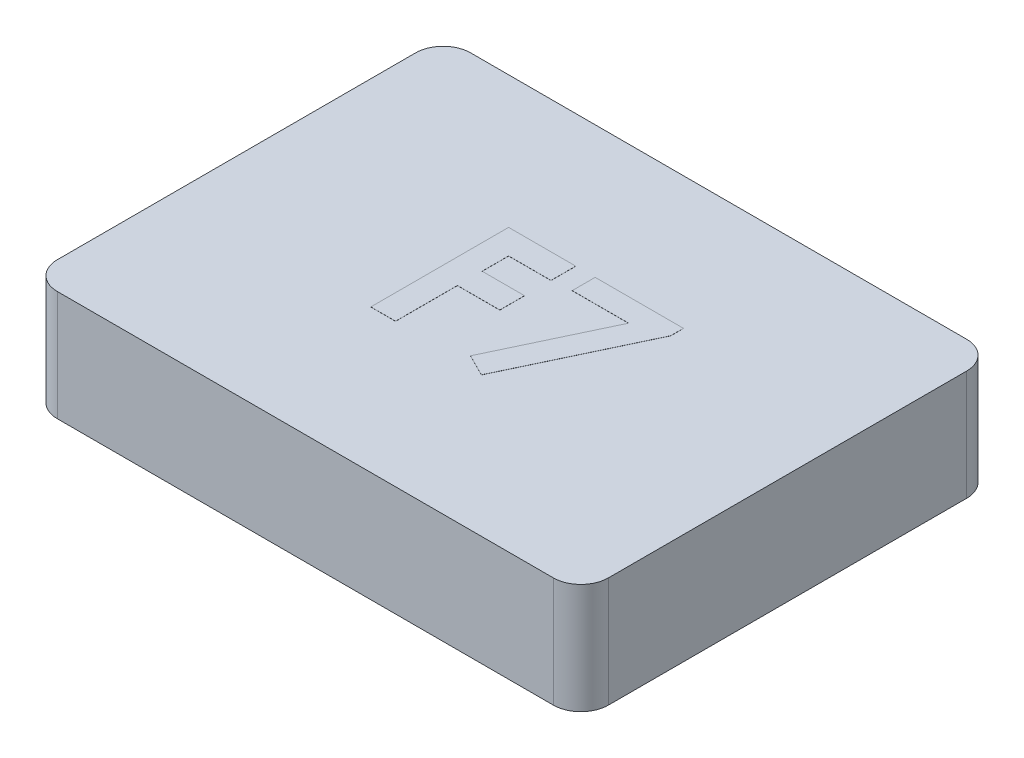
ISO-10303-21;
HEADER;
FILE_DESCRIPTION(('STEP AP214'),'2;1');
FILE_NAME('part.step','',(''),(''),'','','');
FILE_SCHEMA(('AUTOMOTIVE_DESIGN { 1 0 10303 214 1 1 1 1 }'));
ENDSEC;
DATA;
#1=APPLICATION_CONTEXT('core data for automotive mechanical design processes');
#2=APPLICATION_PROTOCOL_DEFINITION('international standard','automotive_design',2000,#1);
#3=PRODUCT_CONTEXT('',#1,'mechanical');
#4=PRODUCT('Part','Part','',(#3));
#5=PRODUCT_RELATED_PRODUCT_CATEGORY('part','',(#4));
#6=PRODUCT_DEFINITION_FORMATION('','',#4);
#7=PRODUCT_DEFINITION_CONTEXT('part definition',#1,'design');
#8=PRODUCT_DEFINITION('design','',#6,#7);
#9=PRODUCT_DEFINITION_SHAPE('','',#8);
#10=(LENGTH_UNIT() NAMED_UNIT(*) SI_UNIT(.MILLI.,.METRE.));
#11=(NAMED_UNIT(*) PLANE_ANGLE_UNIT() SI_UNIT($,.RADIAN.));
#12=(NAMED_UNIT(*) SI_UNIT($,.STERADIAN.) SOLID_ANGLE_UNIT());
#13=UNCERTAINTY_MEASURE_WITH_UNIT(LENGTH_MEASURE(1.E-05),#10,'distance_accuracy_value','');
#14=(GEOMETRIC_REPRESENTATION_CONTEXT(3) GLOBAL_UNCERTAINTY_ASSIGNED_CONTEXT((#13)) GLOBAL_UNIT_ASSIGNED_CONTEXT((#10,
#11,#12)) REPRESENTATION_CONTEXT('',''));
#15=CARTESIAN_POINT('',(0.,0.,0.));
#16=DIRECTION('',(0.,0.,1.));
#17=DIRECTION('',(1.,0.,0.));
#18=AXIS2_PLACEMENT_3D('',#15,#16,#17);
#19=CARTESIAN_POINT('',(0.,2.54,-9.525));
#20=DIRECTION('',(1.,0.,0.));
#21=DIRECTION('',(0.,0.,-1.));
#22=AXIS2_PLACEMENT_3D('',#19,#20,#21);
#23=PLANE('',#22);
#24=DIRECTION('',(0.,0.,1.));
#25=VECTOR('',#24,1.);
#26=CARTESIAN_POINT('',(0.,2.54,-9.525));
#27=LINE('',#26,#25);
#28=CARTESIAN_POINT('',(0.,2.54,-8.89));
#29=VERTEX_POINT('',#28);
#30=CARTESIAN_POINT('',(0.,2.54,-0.635000000000004));
#31=VERTEX_POINT('',#30);
#32=EDGE_CURVE('E406',#29,#31,#27,.T.);
#33=ORIENTED_EDGE('',*,*,#32,.F.);
#34=DIRECTION('',(0.,-1.,0.));
#35=VECTOR('',#34,1.);
#36=CARTESIAN_POINT('',(0.,2.54,-8.89));
#37=LINE('',#36,#35);
#38=CARTESIAN_POINT('',(0.,0.,-8.89));
#39=VERTEX_POINT('',#38);
#40=EDGE_CURVE('E431',#29,#39,#37,.T.);
#41=ORIENTED_EDGE('',*,*,#40,.T.);
#42=DIRECTION('',(0.,0.,1.));
#43=VECTOR('',#42,1.);
#44=CARTESIAN_POINT('',(0.,0.,-9.525));
#45=LINE('',#44,#43);
#46=CARTESIAN_POINT('',(0.,0.,-0.635000000000004));
#47=VERTEX_POINT('',#46);
#48=EDGE_CURVE('E386',#39,#47,#45,.T.);
#49=ORIENTED_EDGE('',*,*,#48,.T.);
#50=DIRECTION('',(0.,-1.,0.));
#51=VECTOR('',#50,1.);
#52=CARTESIAN_POINT('',(0.,2.54,-0.635));
#53=LINE('',#52,#51);
#54=EDGE_CURVE('E419',#47,#31,#53,.F.);
#55=ORIENTED_EDGE('',*,*,#54,.T.);
#56=EDGE_LOOP('',(#33,#41,#49,#55));
#57=FACE_BOUND('',#56,.T.);
#58=ADVANCED_FACE('F33',(#57),#23,.F.);
#59=CARTESIAN_POINT('',(0.,2.54,0.));
#60=DIRECTION('',(0.,0.,-1.));
#61=DIRECTION('',(-1.,0.,0.));
#62=AXIS2_PLACEMENT_3D('',#59,#60,#61);
#63=PLANE('',#62);
#64=DIRECTION('',(1.,0.,0.));
#65=VECTOR('',#64,1.);
#66=CARTESIAN_POINT('',(0.,0.,0.));
#67=LINE('',#66,#65);
#68=CARTESIAN_POINT('',(0.635,0.,0.));
#69=VERTEX_POINT('',#68);
#70=CARTESIAN_POINT('',(12.065,0.,0.));
#71=VERTEX_POINT('',#70);
#72=EDGE_CURVE('E422',#69,#71,#67,.T.);
#73=ORIENTED_EDGE('',*,*,#72,.T.);
#74=DIRECTION('',(0.,-1.,0.));
#75=VECTOR('',#74,1.);
#76=CARTESIAN_POINT('',(12.065,2.54,0.));
#77=LINE('',#76,#75);
#78=CARTESIAN_POINT('',(12.065,2.54,0.));
#79=VERTEX_POINT('',#78);
#80=EDGE_CURVE('E41',#71,#79,#77,.F.);
#81=ORIENTED_EDGE('',*,*,#80,.T.);
#82=DIRECTION('',(1.,0.,0.));
#83=VECTOR('',#82,1.);
#84=CARTESIAN_POINT('',(0.,2.54,0.));
#85=LINE('',#84,#83);
#86=CARTESIAN_POINT('',(0.635,2.54,0.));
#87=VERTEX_POINT('',#86);
#88=EDGE_CURVE('E409',#87,#79,#85,.T.);
#89=ORIENTED_EDGE('',*,*,#88,.F.);
#90=DIRECTION('',(0.,-1.,0.));
#91=VECTOR('',#90,1.);
#92=CARTESIAN_POINT('',(0.635,2.54,0.));
#93=LINE('',#92,#91);
#94=EDGE_CURVE('E460',#87,#69,#93,.T.);
#95=ORIENTED_EDGE('',*,*,#94,.T.);
#96=EDGE_LOOP('',(#73,#81,#89,#95));
#97=FACE_BOUND('',#96,.T.);
#98=ADVANCED_FACE('F465',(#97),#63,.F.);
#99=CARTESIAN_POINT('',(12.7,2.54,0.));
#100=DIRECTION('',(-1.,0.,0.));
#101=DIRECTION('',(0.,0.,1.));
#102=AXIS2_PLACEMENT_3D('',#99,#100,#101);
#103=PLANE('',#102);
#104=DIRECTION('',(0.,0.,-1.));
#105=VECTOR('',#104,1.);
#106=CARTESIAN_POINT('',(12.7,0.,0.));
#107=LINE('',#106,#105);
#108=CARTESIAN_POINT('',(12.7,0.,-0.635));
#109=VERTEX_POINT('',#108);
#110=CARTESIAN_POINT('',(12.7,0.,-8.89));
#111=VERTEX_POINT('',#110);
#112=EDGE_CURVE('E425',#109,#111,#107,.T.);
#113=ORIENTED_EDGE('',*,*,#112,.T.);
#114=DIRECTION('',(0.,-1.,0.));
#115=VECTOR('',#114,1.);
#116=CARTESIAN_POINT('',(12.7,2.54,-8.89));
#117=LINE('',#116,#115);
#118=CARTESIAN_POINT('',(12.7,2.54,-8.89));
#119=VERTEX_POINT('',#118);
#120=EDGE_CURVE('E458',#111,#119,#117,.F.);
#121=ORIENTED_EDGE('',*,*,#120,.T.);
#122=DIRECTION('',(0.,0.,-1.));
#123=VECTOR('',#122,1.);
#124=CARTESIAN_POINT('',(12.7,2.54,0.));
#125=LINE('',#124,#123);
#126=CARTESIAN_POINT('',(12.7,2.54,-0.635));
#127=VERTEX_POINT('',#126);
#128=EDGE_CURVE('E413',#127,#119,#125,.T.);
#129=ORIENTED_EDGE('',*,*,#128,.F.);
#130=DIRECTION('',(0.,-1.,0.));
#131=VECTOR('',#130,1.);
#132=CARTESIAN_POINT('',(12.7,2.54,-0.635));
#133=LINE('',#132,#131);
#134=EDGE_CURVE('E455',#127,#109,#133,.T.);
#135=ORIENTED_EDGE('',*,*,#134,.T.);
#136=EDGE_LOOP('',(#113,#121,#129,#135));
#137=FACE_BOUND('',#136,.T.);
#138=ADVANCED_FACE('F478',(#137),#103,.F.);
#139=CARTESIAN_POINT('',(12.7,2.54,-9.525));
#140=DIRECTION('',(0.,0.,1.));
#141=DIRECTION('',(1.,0.,0.));
#142=AXIS2_PLACEMENT_3D('',#139,#140,#141);
#143=PLANE('',#142);
#144=DIRECTION('',(-1.,0.,0.));
#145=VECTOR('',#144,1.);
#146=CARTESIAN_POINT('',(12.7,0.,-9.525));
#147=LINE('',#146,#145);
#148=CARTESIAN_POINT('',(12.065,0.,-9.525));
#149=VERTEX_POINT('',#148);
#150=CARTESIAN_POINT('',(0.634999999999995,0.,-9.525));
#151=VERTEX_POINT('',#150);
#152=EDGE_CURVE('E410',#149,#151,#147,.T.);
#153=ORIENTED_EDGE('',*,*,#152,.T.);
#154=DIRECTION('',(0.,-1.,0.));
#155=VECTOR('',#154,1.);
#156=CARTESIAN_POINT('',(0.634999999999995,2.54,-9.525));
#157=LINE('',#156,#155);
#158=CARTESIAN_POINT('',(0.634999999999995,2.54,-9.525));
#159=VERTEX_POINT('',#158);
#160=EDGE_CURVE('E445',#151,#159,#157,.F.);
#161=ORIENTED_EDGE('',*,*,#160,.T.);
#162=DIRECTION('',(-1.,0.,0.));
#163=VECTOR('',#162,1.);
#164=CARTESIAN_POINT('',(12.7,2.54,-9.525));
#165=LINE('',#164,#163);
#166=CARTESIAN_POINT('',(12.065,2.54,-9.525));
#167=VERTEX_POINT('',#166);
#168=EDGE_CURVE('E416',#167,#159,#165,.T.);
#169=ORIENTED_EDGE('',*,*,#168,.F.);
#170=DIRECTION('',(0.,-1.,0.));
#171=VECTOR('',#170,1.);
#172=CARTESIAN_POINT('',(12.065,2.54,-9.525));
#173=LINE('',#172,#171);
#174=EDGE_CURVE('E442',#167,#149,#173,.T.);
#175=ORIENTED_EDGE('',*,*,#174,.T.);
#176=EDGE_LOOP('',(#153,#161,#169,#175));
#177=FACE_BOUND('',#176,.T.);
#178=ADVANCED_FACE('F490',(#177),#143,.F.);
#179=CARTESIAN_POINT('',(0.,2.54,0.));
#180=DIRECTION('',(0.,1.,0.));
#181=DIRECTION('',(0.,0.,1.));
#182=AXIS2_PLACEMENT_3D('',#179,#180,#181);
#183=PLANE('',#182);
#184=DIRECTION('',(0.,0.,-1.));
#185=VECTOR('',#184,1.);
#186=CARTESIAN_POINT('',(6.55189743589743,2.54,-5.94783333333333));
#187=LINE('',#186,#185);
#188=CARTESIAN_POINT('',(6.55189743589743,2.54,-5.94783333333333));
#189=VERTEX_POINT('',#188);
#190=CARTESIAN_POINT('',(6.55189743589743,2.54,-6.477));
#191=VERTEX_POINT('',#190);
#192=EDGE_CURVE('E263',#189,#191,#187,.T.);
#193=ORIENTED_EDGE('',*,*,#192,.T.);
#194=DIRECTION('',(1.,0.,0.));
#195=VECTOR('',#194,1.);
#196=CARTESIAN_POINT('',(6.55189743589743,2.54,-6.477));
#197=LINE('',#196,#195);
#198=CARTESIAN_POINT('',(8.58715384615384,2.54,-6.477));
#199=VERTEX_POINT('',#198);
#200=EDGE_CURVE('E229',#191,#199,#197,.T.);
#201=ORIENTED_EDGE('',*,*,#200,.T.);
#202=DIRECTION('',(0.,0.,1.));
#203=VECTOR('',#202,1.);
#204=CARTESIAN_POINT('',(8.58715384615384,2.54,-6.477));
#205=LINE('',#204,#203);
#206=CARTESIAN_POINT('',(8.58715384615384,2.54,-6.18125180288462));
#207=VERTEX_POINT('',#206);
#208=EDGE_CURVE('E266',#199,#207,#205,.T.);
#209=ORIENTED_EDGE('',*,*,#208,.T.);
#210=DIRECTION('',(-0.427610471419761,0.,0.903963099209348));
#211=VECTOR('',#210,1.);
#212=CARTESIAN_POINT('',(8.58715384615384,2.54,-6.18125180288462));
#213=LINE('',#212,#211);
#214=CARTESIAN_POINT('',(7.18664302884615,2.54,-3.22058974358974));
#215=VERTEX_POINT('',#214);
#216=EDGE_CURVE('E268',#207,#215,#213,.T.);
#217=ORIENTED_EDGE('',*,*,#216,.T.);
#218=DIRECTION('',(-0.893073384293623,0.,-0.44991102483306));
#219=VECTOR('',#218,1.);
#220=CARTESIAN_POINT('',(7.18664302884615,2.54,-3.22058974358974));
#221=LINE('',#220,#219);
#222=CARTESIAN_POINT('',(6.68164503205128,2.54,-3.4749967948718));
#223=VERTEX_POINT('',#222);
#224=EDGE_CURVE('E270',#215,#223,#221,.T.);
#225=ORIENTED_EDGE('',*,*,#224,.T.);
#226=DIRECTION('',(0.427766523959501,0.,-0.903889263670946));
#227=VECTOR('',#226,1.);
#228=CARTESIAN_POINT('',(6.68164503205128,2.54,-3.4749967948718));
#229=LINE('',#228,#227);
#230=CARTESIAN_POINT('',(7.85191746794871,2.54,-5.94783333333333));
#231=VERTEX_POINT('',#230);
#232=EDGE_CURVE('E53',#223,#231,#229,.T.);
#233=ORIENTED_EDGE('',*,*,#232,.T.);
#234=DIRECTION('',(-1.,0.,0.));
#235=VECTOR('',#234,1.);
#236=CARTESIAN_POINT('',(7.85191746794871,2.54,-5.94783333333333));
#237=LINE('',#236,#235);
#238=EDGE_CURVE('E48',#231,#189,#237,.T.);
#239=ORIENTED_EDGE('',*,*,#238,.T.);
#240=EDGE_LOOP('',(#193,#201,#209,#217,#225,#233,#239));
#241=FACE_BOUND('',#240,.T.);
#242=DIRECTION('',(0.,0.,-1.));
#243=VECTOR('',#242,1.);
#244=CARTESIAN_POINT('',(4.55734615384615,2.54,-3.302));
#245=LINE('',#244,#243);
#246=CARTESIAN_POINT('',(4.55734615384615,2.54,-3.302));
#247=VERTEX_POINT('',#246);
#248=CARTESIAN_POINT('',(4.55734615384615,2.54,-6.477));
#249=VERTEX_POINT('',#248);
#250=EDGE_CURVE('E274',#247,#249,#245,.T.);
#251=ORIENTED_EDGE('',*,*,#250,.T.);
#252=DIRECTION('',(1.,0.,0.));
#253=VECTOR('',#252,1.);
#254=CARTESIAN_POINT('',(4.55734615384615,2.54,-6.477));
#255=LINE('',#254,#253);
#256=CARTESIAN_POINT('',(6.10414102564102,2.54,-6.477));
#257=VERTEX_POINT('',#256);
#258=EDGE_CURVE('E320',#249,#257,#255,.T.);
#259=ORIENTED_EDGE('',*,*,#258,.T.);
#260=DIRECTION('',(0.,0.,1.));
#261=VECTOR('',#260,1.);
#262=CARTESIAN_POINT('',(6.10414102564102,2.54,-6.477));
#263=LINE('',#262,#261);
#264=CARTESIAN_POINT('',(6.10414102564102,2.54,-5.90712820512821));
#265=VERTEX_POINT('',#264);
#266=EDGE_CURVE('E322',#257,#265,#263,.T.);
#267=ORIENTED_EDGE('',*,*,#266,.T.);
#268=DIRECTION('',(-1.,0.,0.));
#269=VECTOR('',#268,1.);
#270=CARTESIAN_POINT('',(6.10414102564102,2.54,-5.90712820512821));
#271=LINE('',#270,#269);
#272=CARTESIAN_POINT('',(5.12721794871794,2.54,-5.90712820512821));
#273=VERTEX_POINT('',#272);
#274=EDGE_CURVE('E324',#265,#273,#271,.T.);
#275=ORIENTED_EDGE('',*,*,#274,.T.);
#276=DIRECTION('',(0.,0.,1.));
#277=VECTOR('',#276,1.);
#278=CARTESIAN_POINT('',(5.12721794871794,2.54,-5.90712820512821));
#279=LINE('',#278,#277);
#280=CARTESIAN_POINT('',(5.12721794871794,2.54,-5.29655128205128));
#281=VERTEX_POINT('',#280);
#282=EDGE_CURVE('E326',#273,#281,#279,.T.);
#283=ORIENTED_EDGE('',*,*,#282,.T.);
#284=DIRECTION('',(1.,0.,0.));
#285=VECTOR('',#284,1.);
#286=CARTESIAN_POINT('',(5.12721794871794,2.54,-5.29655128205128));
#287=LINE('',#286,#285);
#288=CARTESIAN_POINT('',(6.10414102564102,2.54,-5.29655128205128));
#289=VERTEX_POINT('',#288);
#290=EDGE_CURVE('E328',#281,#289,#287,.T.);
#291=ORIENTED_EDGE('',*,*,#290,.T.);
#292=DIRECTION('',(0.,0.,1.));
#293=VECTOR('',#292,1.);
#294=CARTESIAN_POINT('',(6.10414102564102,2.54,-5.29655128205128));
#295=LINE('',#294,#293);
#296=CARTESIAN_POINT('',(6.10414102564102,2.54,-4.72667948717949));
#297=VERTEX_POINT('',#296);
#298=EDGE_CURVE('E330',#289,#297,#295,.T.);
#299=ORIENTED_EDGE('',*,*,#298,.T.);
#300=DIRECTION('',(-1.,0.,0.));
#301=VECTOR('',#300,1.);
#302=CARTESIAN_POINT('',(6.10414102564102,2.54,-4.72667948717949));
#303=LINE('',#302,#301);
#304=CARTESIAN_POINT('',(5.12721794871794,2.54,-4.72667948717949));
#305=VERTEX_POINT('',#304);
#306=EDGE_CURVE('E332',#297,#305,#303,.T.);
#307=ORIENTED_EDGE('',*,*,#306,.T.);
#308=DIRECTION('',(0.,0.,1.));
#309=VECTOR('',#308,1.);
#310=CARTESIAN_POINT('',(5.12721794871794,2.54,-4.72667948717949));
#311=LINE('',#310,#309);
#312=CARTESIAN_POINT('',(5.12721794871794,2.54,-3.302));
#313=VERTEX_POINT('',#312);
#314=EDGE_CURVE('E334',#305,#313,#311,.T.);
#315=ORIENTED_EDGE('',*,*,#314,.T.);
#316=DIRECTION('',(-1.,0.,0.));
#317=VECTOR('',#316,1.);
#318=CARTESIAN_POINT('',(5.12721794871794,2.54,-3.302));
#319=LINE('',#318,#317);
#320=EDGE_CURVE('E291',#313,#247,#319,.T.);
#321=ORIENTED_EDGE('',*,*,#320,.T.);
#322=EDGE_LOOP('',(#251,#259,#267,#275,#283,#291,#299,#307,#315,#321));
#323=FACE_BOUND('',#322,.T.);
#324=ORIENTED_EDGE('',*,*,#168,.T.);
#325=CARTESIAN_POINT('',(0.634999999999995,2.54,-8.89));
#326=DIRECTION('',(0.,1.,0.));
#327=DIRECTION('',(0.,0.,1.));
#328=AXIS2_PLACEMENT_3D('',#325,#326,#327);
#329=CIRCLE('',#328,0.635);
#330=EDGE_CURVE('E453',#159,#29,#329,.T.);
#331=ORIENTED_EDGE('',*,*,#330,.T.);
#332=ORIENTED_EDGE('',*,*,#32,.T.);
#333=CARTESIAN_POINT('',(0.635,2.54,-0.635));
#334=DIRECTION('',(0.,1.,0.));
#335=DIRECTION('',(0.,0.,1.));
#336=AXIS2_PLACEMENT_3D('',#333,#334,#335);
#337=CIRCLE('',#336,0.635);
#338=EDGE_CURVE('E447',#31,#87,#337,.T.);
#339=ORIENTED_EDGE('',*,*,#338,.T.);
#340=ORIENTED_EDGE('',*,*,#88,.T.);
#341=CARTESIAN_POINT('',(12.065,2.54,-0.635));
#342=DIRECTION('',(0.,1.,0.));
#343=DIRECTION('',(0.,0.,1.));
#344=AXIS2_PLACEMENT_3D('',#341,#342,#343);
#345=CIRCLE('',#344,0.635);
#346=EDGE_CURVE('E449',#79,#127,#345,.T.);
#347=ORIENTED_EDGE('',*,*,#346,.T.);
#348=ORIENTED_EDGE('',*,*,#128,.T.);
#349=CARTESIAN_POINT('',(12.065,2.54,-8.89));
#350=DIRECTION('',(0.,1.,0.));
#351=DIRECTION('',(0.,0.,1.));
#352=AXIS2_PLACEMENT_3D('',#349,#350,#351);
#353=CIRCLE('',#352,0.635);
#354=EDGE_CURVE('E451',#119,#167,#353,.T.);
#355=ORIENTED_EDGE('',*,*,#354,.T.);
#356=EDGE_LOOP('',(#324,#331,#332,#339,#340,#347,#348,#355));
#357=FACE_BOUND('',#356,.T.);
#358=ADVANCED_FACE('F471',(#241,#323,#357),#183,.T.);
#359=CARTESIAN_POINT('',(0.,0.,0.));
#360=DIRECTION('',(0.,1.,0.));
#361=DIRECTION('',(0.,0.,1.));
#362=AXIS2_PLACEMENT_3D('',#359,#360,#361);
#363=PLANE('',#362);
#364=DIRECTION('',(-1.,0.,0.));
#365=VECTOR('',#364,1.);
#366=CARTESIAN_POINT('',(12.7,0.,-8.89));
#367=LINE('',#366,#365);
#368=CARTESIAN_POINT('',(12.065,0.,-8.89));
#369=VERTEX_POINT('',#368);
#370=CARTESIAN_POINT('',(0.634999999999995,0.,-8.89));
#371=VERTEX_POINT('',#370);
#372=EDGE_CURVE('E374',#369,#371,#367,.T.);
#373=ORIENTED_EDGE('',*,*,#372,.T.);
#374=DIRECTION('',(0.,0.,1.));
#375=VECTOR('',#374,1.);
#376=CARTESIAN_POINT('',(0.634999999999995,0.,-9.525));
#377=LINE('',#376,#375);
#378=CARTESIAN_POINT('',(0.635,0.,-0.635));
#379=VERTEX_POINT('',#378);
#380=EDGE_CURVE('E369',#371,#379,#377,.T.);
#381=ORIENTED_EDGE('',*,*,#380,.T.);
#382=DIRECTION('',(1.,0.,0.));
#383=VECTOR('',#382,1.);
#384=CARTESIAN_POINT('',(0.,0.,-0.635));
#385=LINE('',#384,#383);
#386=CARTESIAN_POINT('',(12.065,0.,-0.635));
#387=VERTEX_POINT('',#386);
#388=EDGE_CURVE('E398',#379,#387,#385,.T.);
#389=ORIENTED_EDGE('',*,*,#388,.T.);
#390=DIRECTION('',(0.,0.,-1.));
#391=VECTOR('',#390,1.);
#392=CARTESIAN_POINT('',(12.065,0.,0.));
#393=LINE('',#392,#391);
#394=EDGE_CURVE('E401',#387,#369,#393,.T.);
#395=ORIENTED_EDGE('',*,*,#394,.T.);
#396=EDGE_LOOP('',(#373,#381,#389,#395));
#397=FACE_BOUND('',#396,.T.);
#398=ORIENTED_EDGE('',*,*,#48,.F.);
#399=CARTESIAN_POINT('',(0.634999999999995,0.,-8.89));
#400=DIRECTION('',(0.,1.,0.));
#401=DIRECTION('',(0.,0.,1.));
#402=AXIS2_PLACEMENT_3D('',#399,#400,#401);
#403=CIRCLE('',#402,0.635);
#404=EDGE_CURVE('E440',#39,#151,#403,.F.);
#405=ORIENTED_EDGE('',*,*,#404,.T.);
#406=ORIENTED_EDGE('',*,*,#152,.F.);
#407=CARTESIAN_POINT('',(12.065,0.,-8.89));
#408=DIRECTION('',(0.,1.,0.));
#409=DIRECTION('',(0.,0.,1.));
#410=AXIS2_PLACEMENT_3D('',#407,#408,#409);
#411=CIRCLE('',#410,0.635);
#412=EDGE_CURVE('E438',#149,#111,#411,.F.);
#413=ORIENTED_EDGE('',*,*,#412,.T.);
#414=ORIENTED_EDGE('',*,*,#112,.F.);
#415=CARTESIAN_POINT('',(12.065,0.,-0.635));
#416=DIRECTION('',(0.,1.,0.));
#417=DIRECTION('',(0.,0.,1.));
#418=AXIS2_PLACEMENT_3D('',#415,#416,#417);
#419=CIRCLE('',#418,0.635);
#420=EDGE_CURVE('E436',#109,#71,#419,.F.);
#421=ORIENTED_EDGE('',*,*,#420,.T.);
#422=ORIENTED_EDGE('',*,*,#72,.F.);
#423=CARTESIAN_POINT('',(0.635,0.,-0.635));
#424=DIRECTION('',(0.,1.,0.));
#425=DIRECTION('',(0.,0.,1.));
#426=AXIS2_PLACEMENT_3D('',#423,#424,#425);
#427=CIRCLE('',#426,0.635);
#428=EDGE_CURVE('E434',#69,#47,#427,.F.);
#429=ORIENTED_EDGE('',*,*,#428,.T.);
#430=EDGE_LOOP('',(#398,#405,#406,#413,#414,#421,#422,#429));
#431=FACE_BOUND('',#430,.T.);
#432=ADVANCED_FACE('F482',(#397,#431),#363,.F.);
#433=CARTESIAN_POINT('',(0.634999999999995,2.54,-8.89));
#434=DIRECTION('',(0.,-1.,0.));
#435=DIRECTION('',(0.,0.,-1.));
#436=AXIS2_PLACEMENT_3D('',#433,#434,#435);
#437=CYLINDRICAL_SURFACE('',#436,0.635);
#438=ORIENTED_EDGE('',*,*,#330,.F.);
#439=ORIENTED_EDGE('',*,*,#160,.F.);
#440=ORIENTED_EDGE('',*,*,#404,.F.);
#441=ORIENTED_EDGE('',*,*,#40,.F.);
#442=EDGE_LOOP('',(#438,#439,#440,#441));
#443=FACE_BOUND('',#442,.T.);
#444=ADVANCED_FACE('F496',(#443),#437,.T.);
#445=CARTESIAN_POINT('',(12.065,2.54,-8.89));
#446=DIRECTION('',(0.,-1.,0.));
#447=DIRECTION('',(0.,0.,-1.));
#448=AXIS2_PLACEMENT_3D('',#445,#446,#447);
#449=CYLINDRICAL_SURFACE('',#448,0.635);
#450=ORIENTED_EDGE('',*,*,#354,.F.);
#451=ORIENTED_EDGE('',*,*,#120,.F.);
#452=ORIENTED_EDGE('',*,*,#412,.F.);
#453=ORIENTED_EDGE('',*,*,#174,.F.);
#454=EDGE_LOOP('',(#450,#451,#452,#453));
#455=FACE_BOUND('',#454,.T.);
#456=ADVANCED_FACE('F487',(#455),#449,.T.);
#457=CARTESIAN_POINT('',(12.065,2.54,-0.635));
#458=DIRECTION('',(0.,-1.,0.));
#459=DIRECTION('',(0.,0.,-1.));
#460=AXIS2_PLACEMENT_3D('',#457,#458,#459);
#461=CYLINDRICAL_SURFACE('',#460,0.635);
#462=ORIENTED_EDGE('',*,*,#346,.F.);
#463=ORIENTED_EDGE('',*,*,#80,.F.);
#464=ORIENTED_EDGE('',*,*,#420,.F.);
#465=ORIENTED_EDGE('',*,*,#134,.F.);
#466=EDGE_LOOP('',(#462,#463,#464,#465));
#467=FACE_BOUND('',#466,.T.);
#468=ADVANCED_FACE('F475',(#467),#461,.T.);
#469=CARTESIAN_POINT('',(0.635,2.54,-0.635));
#470=DIRECTION('',(0.,-1.,0.));
#471=DIRECTION('',(0.,0.,-1.));
#472=AXIS2_PLACEMENT_3D('',#469,#470,#471);
#473=CYLINDRICAL_SURFACE('',#472,0.635);
#474=ORIENTED_EDGE('',*,*,#338,.F.);
#475=ORIENTED_EDGE('',*,*,#54,.F.);
#476=ORIENTED_EDGE('',*,*,#428,.F.);
#477=ORIENTED_EDGE('',*,*,#94,.F.);
#478=EDGE_LOOP('',(#474,#475,#476,#477));
#479=FACE_BOUND('',#478,.T.);
#480=ADVANCED_FACE('F35',(#479),#473,.T.);
#481=CARTESIAN_POINT('',(0.634999999999995,2.54,-9.525));
#482=DIRECTION('',(1.,0.,0.));
#483=DIRECTION('',(0.,0.,-1.));
#484=AXIS2_PLACEMENT_3D('',#481,#482,#483);
#485=PLANE('',#484);
#486=DIRECTION('',(0.,0.,1.));
#487=VECTOR('',#486,1.);
#488=CARTESIAN_POINT('',(0.634999999999995,1.905,-9.525));
#489=LINE('',#488,#487);
#490=CARTESIAN_POINT('',(0.634999999999995,1.905,-8.89));
#491=VERTEX_POINT('',#490);
#492=CARTESIAN_POINT('',(0.635,1.905,-0.635));
#493=VERTEX_POINT('',#492);
#494=EDGE_CURVE('E370',#491,#493,#489,.T.);
#495=ORIENTED_EDGE('',*,*,#494,.T.);
#496=DIRECTION('',(0.,1.,0.));
#497=VECTOR('',#496,1.);
#498=CARTESIAN_POINT('',(0.635,2.54,-0.635));
#499=LINE('',#498,#497);
#500=EDGE_CURVE('E379',#379,#493,#499,.T.);
#501=ORIENTED_EDGE('',*,*,#500,.F.);
#502=ORIENTED_EDGE('',*,*,#380,.F.);
#503=DIRECTION('',(0.,1.,0.));
#504=VECTOR('',#503,1.);
#505=CARTESIAN_POINT('',(0.634999999999995,2.54,-8.89));
#506=LINE('',#505,#504);
#507=EDGE_CURVE('E375',#371,#491,#506,.T.);
#508=ORIENTED_EDGE('',*,*,#507,.T.);
#509=EDGE_LOOP('',(#495,#501,#502,#508));
#510=FACE_BOUND('',#509,.T.);
#511=ADVANCED_FACE('F501',(#510),#485,.T.);
#512=CARTESIAN_POINT('',(0.,2.54,-0.635));
#513=DIRECTION('',(0.,0.,-1.));
#514=DIRECTION('',(-1.,0.,0.));
#515=AXIS2_PLACEMENT_3D('',#512,#513,#514);
#516=PLANE('',#515);
#517=ORIENTED_EDGE('',*,*,#388,.F.);
#518=ORIENTED_EDGE('',*,*,#500,.T.);
#519=DIRECTION('',(1.,0.,0.));
#520=VECTOR('',#519,1.);
#521=CARTESIAN_POINT('',(0.,1.905,-0.635));
#522=LINE('',#521,#520);
#523=CARTESIAN_POINT('',(12.065,1.905,-0.635));
#524=VERTEX_POINT('',#523);
#525=EDGE_CURVE('E373',#493,#524,#522,.T.);
#526=ORIENTED_EDGE('',*,*,#525,.T.);
#527=DIRECTION('',(0.,1.,0.));
#528=VECTOR('',#527,1.);
#529=CARTESIAN_POINT('',(12.065,2.54,-0.635));
#530=LINE('',#529,#528);
#531=EDGE_CURVE('E383',#387,#524,#530,.T.);
#532=ORIENTED_EDGE('',*,*,#531,.F.);
#533=EDGE_LOOP('',(#517,#518,#526,#532));
#534=FACE_BOUND('',#533,.T.);
#535=ADVANCED_FACE('F506',(#534),#516,.T.);
#536=CARTESIAN_POINT('',(12.065,2.54,0.));
#537=DIRECTION('',(-1.,0.,0.));
#538=DIRECTION('',(0.,0.,1.));
#539=AXIS2_PLACEMENT_3D('',#536,#537,#538);
#540=PLANE('',#539);
#541=ORIENTED_EDGE('',*,*,#394,.F.);
#542=ORIENTED_EDGE('',*,*,#531,.T.);
#543=DIRECTION('',(0.,0.,-1.));
#544=VECTOR('',#543,1.);
#545=CARTESIAN_POINT('',(12.065,1.905,0.));
#546=LINE('',#545,#544);
#547=CARTESIAN_POINT('',(12.065,1.905,-8.89));
#548=VERTEX_POINT('',#547);
#549=EDGE_CURVE('E389',#524,#548,#546,.T.);
#550=ORIENTED_EDGE('',*,*,#549,.T.);
#551=DIRECTION('',(0.,1.,0.));
#552=VECTOR('',#551,1.);
#553=CARTESIAN_POINT('',(12.065,2.54,-8.89));
#554=LINE('',#553,#552);
#555=EDGE_CURVE('E378',#369,#548,#554,.T.);
#556=ORIENTED_EDGE('',*,*,#555,.F.);
#557=EDGE_LOOP('',(#541,#542,#550,#556));
#558=FACE_BOUND('',#557,.T.);
#559=ADVANCED_FACE('F559',(#558),#540,.T.);
#560=CARTESIAN_POINT('',(12.7,2.54,-8.89));
#561=DIRECTION('',(0.,0.,1.));
#562=DIRECTION('',(1.,0.,0.));
#563=AXIS2_PLACEMENT_3D('',#560,#561,#562);
#564=PLANE('',#563);
#565=ORIENTED_EDGE('',*,*,#372,.F.);
#566=ORIENTED_EDGE('',*,*,#555,.T.);
#567=DIRECTION('',(-1.,0.,0.));
#568=VECTOR('',#567,1.);
#569=CARTESIAN_POINT('',(12.7,1.905,-8.89));
#570=LINE('',#569,#568);
#571=EDGE_CURVE('E382',#548,#491,#570,.T.);
#572=ORIENTED_EDGE('',*,*,#571,.T.);
#573=ORIENTED_EDGE('',*,*,#507,.F.);
#574=EDGE_LOOP('',(#565,#566,#572,#573));
#575=FACE_BOUND('',#574,.T.);
#576=ADVANCED_FACE('F569',(#575),#564,.T.);
#577=CARTESIAN_POINT('',(0.,1.905,0.));
#578=DIRECTION('',(0.,1.,0.));
#579=DIRECTION('',(0.,0.,1.));
#580=AXIS2_PLACEMENT_3D('',#577,#578,#579);
#581=PLANE('',#580);
#582=CARTESIAN_POINT('',(6.35,1.905,-4.7625));
#583=DIRECTION('',(0.,1.,0.));
#584=DIRECTION('',(0.,0.,1.));
#585=AXIS2_PLACEMENT_3D('',#582,#583,#584);
#586=CIRCLE('',#585,2.54);
#587=CARTESIAN_POINT('',(6.35,1.905,-2.2225));
#588=VERTEX_POINT('',#587);
#589=EDGE_CURVE('E11',#588,#588,#586,.F.);
#590=ORIENTED_EDGE('',*,*,#589,.F.);
#591=EDGE_LOOP('',(#590));
#592=FACE_BOUND('',#591,.T.);
#593=ORIENTED_EDGE('',*,*,#571,.F.);
#594=ORIENTED_EDGE('',*,*,#549,.F.);
#595=ORIENTED_EDGE('',*,*,#525,.F.);
#596=ORIENTED_EDGE('',*,*,#494,.F.);
#597=EDGE_LOOP('',(#593,#594,#595,#596));
#598=FACE_BOUND('',#597,.T.);
#599=ADVANCED_FACE('F579',(#592,#598),#581,.F.);
#600=CARTESIAN_POINT('',(6.35,-7.18420489685532,-4.7625));
#601=DIRECTION('',(0.,1.,0.));
#602=DIRECTION('',(0.,0.,1.));
#603=AXIS2_PLACEMENT_3D('',#600,#601,#602);
#604=CYLINDRICAL_SURFACE('',#603,2.54);
#605=CARTESIAN_POINT('',(6.35,0.,-4.7625));
#606=DIRECTION('',(0.,1.,0.));
#607=DIRECTION('',(0.,0.,1.));
#608=AXIS2_PLACEMENT_3D('',#605,#606,#607);
#609=CIRCLE('',#608,2.54);
#610=CARTESIAN_POINT('',(6.35,0.,-2.2225));
#611=VERTEX_POINT('',#610);
#612=EDGE_CURVE('E340',#611,#611,#609,.T.);
#613=CARTESIAN_POINT('',(6.35,0.,-2.2225));
#614=CARTESIAN_POINT('',(6.35,0.0198437499999991,-2.2225));
#615=CARTESIAN_POINT('',(6.35,0.0396874999999989,-2.2225));
#616=CARTESIAN_POINT('',(6.35,0.079374999999999,-2.2225));
#617=CARTESIAN_POINT('',(6.35,0.0992187499999992,-2.2225));
#618=CARTESIAN_POINT('',(6.35,0.138906249999999,-2.2225));
#619=CARTESIAN_POINT('',(6.35,0.158749999999999,-2.2225));
#620=CARTESIAN_POINT('',(6.35,0.198437499999999,-2.2225));
#621=CARTESIAN_POINT('',(6.35,0.218281249999999,-2.2225));
#622=CARTESIAN_POINT('',(6.35,0.25796875,-2.2225));
#623=CARTESIAN_POINT('',(6.35,0.277812499999999,-2.2225));
#624=CARTESIAN_POINT('',(6.35,0.317499999999999,-2.2225));
#625=CARTESIAN_POINT('',(6.35,0.337343749999999,-2.2225));
#626=CARTESIAN_POINT('',(6.35,0.377031249999999,-2.2225));
#627=CARTESIAN_POINT('',(6.35,0.396874999999999,-2.2225));
#628=CARTESIAN_POINT('',(6.35,0.436562499999999,-2.2225));
#629=CARTESIAN_POINT('',(6.35,0.456406249999999,-2.2225));
#630=CARTESIAN_POINT('',(6.35,0.496093749999999,-2.2225));
#631=CARTESIAN_POINT('',(6.35,0.515937499999999,-2.2225));
#632=CARTESIAN_POINT('',(6.35,0.555624999999999,-2.2225));
#633=CARTESIAN_POINT('',(6.35,0.575468749999999,-2.2225));
#634=CARTESIAN_POINT('',(6.35,0.615156249999999,-2.2225));
#635=CARTESIAN_POINT('',(6.35,0.634999999999999,-2.2225));
#636=CARTESIAN_POINT('',(6.35,0.674687499999998,-2.2225));
#637=CARTESIAN_POINT('',(6.35,0.694531249999998,-2.2225));
#638=CARTESIAN_POINT('',(6.35,0.734218749999998,-2.2225));
#639=CARTESIAN_POINT('',(6.35,0.754062499999998,-2.2225));
#640=CARTESIAN_POINT('',(6.35,0.793749999999998,-2.2225));
#641=CARTESIAN_POINT('',(6.35,0.813593749999999,-2.2225));
#642=CARTESIAN_POINT('',(6.35,0.853281249999999,-2.2225));
#643=CARTESIAN_POINT('',(6.35,0.873124999999999,-2.2225));
#644=CARTESIAN_POINT('',(6.35,0.912812499999999,-2.2225));
#645=CARTESIAN_POINT('',(6.35,0.932656249999999,-2.2225));
#646=CARTESIAN_POINT('',(6.35,0.972343749999998,-2.2225));
#647=CARTESIAN_POINT('',(6.35,0.992187499999998,-2.2225));
#648=CARTESIAN_POINT('',(6.35,1.031875,-2.2225));
#649=CARTESIAN_POINT('',(6.35,1.05171875,-2.2225));
#650=CARTESIAN_POINT('',(6.35,1.09140625,-2.2225));
#651=CARTESIAN_POINT('',(6.35,1.11125,-2.2225));
#652=CARTESIAN_POINT('',(6.35,1.1509375,-2.2225));
#653=CARTESIAN_POINT('',(6.35,1.17078125,-2.2225));
#654=CARTESIAN_POINT('',(6.35,1.21046875,-2.2225));
#655=CARTESIAN_POINT('',(6.35,1.2303125,-2.2225));
#656=CARTESIAN_POINT('',(6.35,1.27,-2.2225));
#657=CARTESIAN_POINT('',(6.35,1.28984375,-2.2225));
#658=CARTESIAN_POINT('',(6.35,1.32953125,-2.2225));
#659=CARTESIAN_POINT('',(6.35,1.349375,-2.2225));
#660=CARTESIAN_POINT('',(6.35,1.3890625,-2.2225));
#661=CARTESIAN_POINT('',(6.35,1.40890625,-2.2225));
#662=CARTESIAN_POINT('',(6.35,1.44859375,-2.2225));
#663=CARTESIAN_POINT('',(6.35,1.4684375,-2.2225));
#664=CARTESIAN_POINT('',(6.35,1.508125,-2.2225));
#665=CARTESIAN_POINT('',(6.35,1.52796875,-2.2225));
#666=CARTESIAN_POINT('',(6.35,1.56765625,-2.2225));
#667=CARTESIAN_POINT('',(6.35,1.5875,-2.2225));
#668=CARTESIAN_POINT('',(6.35,1.6271875,-2.2225));
#669=CARTESIAN_POINT('',(6.35,1.64703125,-2.2225));
#670=CARTESIAN_POINT('',(6.35,1.68671875,-2.2225));
#671=CARTESIAN_POINT('',(6.35,1.7065625,-2.2225));
#672=CARTESIAN_POINT('',(6.35,1.74625,-2.2225));
#673=CARTESIAN_POINT('',(6.35,1.76609375,-2.2225));
#674=CARTESIAN_POINT('',(6.35,1.80578125,-2.2225));
#675=CARTESIAN_POINT('',(6.35,1.825625,-2.2225));
#676=CARTESIAN_POINT('',(6.35,1.8653125,-2.2225));
#677=CARTESIAN_POINT('',(6.35,1.88515625,-2.2225));
#678=CARTESIAN_POINT('',(6.35,1.905,-2.2225));
#679=B_SPLINE_CURVE_WITH_KNOTS('',3,(#613,#614,#615,#616,#617,#618,#619,#620,#621,#622,#623,
#624,#625,#626,#627,#628,#629,#630,#631,#632,#633,#634,#635,#636,#637,#638,#639,#640,#641,#642,
#643,#644,#645,#646,#647,#648,#649,#650,#651,#652,#653,#654,#655,#656,#657,#658,#659,#660,#661,
#662,#663,#664,#665,#666,#667,#668,#669,#670,#671,#672,#673,#674,#675,#676,#677,#678),
.UNSPECIFIED.,.F.,.F.,(4,2,2,2,2,2,2,2,2,2,2,2,2,2,2,2,2,2,2,2,2,2,2,2,2,2,2,2,2,2,2,2,4),(0.,
0.0595312499999997,0.1190625,0.17859375,0.238125,0.29765625,0.3571875,0.41671875,0.47625,
0.53578125,0.5953125,0.654843749999999,0.714374999999999,0.773906249999999,0.8334375,0.89296875,
0.952499999999999,1.01203125,1.0715625,1.13109375,1.190625,1.25015625,1.3096875,1.36921875,
1.42875,1.48828125,1.5478125,1.60734375,1.666875,1.72640625,1.7859375,1.84546875,1.905),.UNSPECIFIED.);
#680=EDGE_CURVE('BSEAM589',#611,#588,#679,.T.);
#681=ORIENTED_EDGE('',*,*,#612,.T.);
#682=ORIENTED_EDGE('',*,*,#589,.T.);
#683=ORIENTED_EDGE('',*,*,#680,.T.);
#684=ORIENTED_EDGE('',*,*,#680,.F.);
#685=EDGE_LOOP('',(#681,#683,#682,#684));
#686=FACE_BOUND('',#685,.T.);
#687=ADVANCED_FACE('F589',(#686),#604,.T.);
#688=CARTESIAN_POINT('',(0.,0.,0.));
#689=DIRECTION('',(0.,1.,0.));
#690=DIRECTION('',(0.,0.,1.));
#691=AXIS2_PLACEMENT_3D('',#688,#689,#690);
#692=PLANE('',#691);
#693=ORIENTED_EDGE('',*,*,#612,.F.);
#694=EDGE_LOOP('',(#693));
#695=FACE_BOUND('',#694,.T.);
#696=ADVANCED_FACE('F599',(#695),#692,.F.);
#697=CARTESIAN_POINT('',(4.55734615384615,2.54254,-3.302));
#698=DIRECTION('',(-1.,0.,0.));
#699=DIRECTION('',(0.,0.,1.));
#700=AXIS2_PLACEMENT_3D('',#697,#698,#699);
#701=PLANE('',#700);
#702=ORIENTED_EDGE('',*,*,#250,.F.);
#703=DIRECTION('',(0.,-1.,0.));
#704=VECTOR('',#703,1.);
#705=CARTESIAN_POINT('',(4.55734615384615,2.54254,-3.302));
#706=LINE('',#705,#704);
#707=CARTESIAN_POINT('',(4.55734615384615,2.54254,-3.302));
#708=VERTEX_POINT('',#707);
#709=EDGE_CURVE('E337',#708,#247,#706,.T.);
#710=ORIENTED_EDGE('',*,*,#709,.F.);
#711=DIRECTION('',(0.,0.,-1.));
#712=VECTOR('',#711,1.);
#713=CARTESIAN_POINT('',(4.55734615384615,2.54254,-3.302));
#714=LINE('',#713,#712);
#715=CARTESIAN_POINT('',(4.55734615384615,2.54254,-6.477));
#716=VERTEX_POINT('',#715);
#717=EDGE_CURVE('E287',#708,#716,#714,.T.);
#718=ORIENTED_EDGE('',*,*,#717,.T.);
#719=DIRECTION('',(0.,-1.,0.));
#720=VECTOR('',#719,1.);
#721=CARTESIAN_POINT('',(4.55734615384615,2.54254,-6.477));
#722=LINE('',#721,#720);
#723=EDGE_CURVE('E318',#716,#249,#722,.T.);
#724=ORIENTED_EDGE('',*,*,#723,.T.);
#725=EDGE_LOOP('',(#702,#710,#718,#724));
#726=FACE_BOUND('',#725,.T.);
#727=ADVANCED_FACE('F609',(#726),#701,.T.);
#728=CARTESIAN_POINT('',(5.12721794871794,2.54254,-3.302));
#729=DIRECTION('',(0.,0.,1.));
#730=DIRECTION('',(1.,0.,0.));
#731=AXIS2_PLACEMENT_3D('',#728,#729,#730);
#732=PLANE('',#731);
#733=ORIENTED_EDGE('',*,*,#320,.F.);
#734=DIRECTION('',(0.,-1.,0.));
#735=VECTOR('',#734,1.);
#736=CARTESIAN_POINT('',(5.12721794871794,2.54254,-3.302));
#737=LINE('',#736,#735);
#738=CARTESIAN_POINT('',(5.12721794871794,2.54254,-3.302));
#739=VERTEX_POINT('',#738);
#740=EDGE_CURVE('E341',#739,#313,#737,.T.);
#741=ORIENTED_EDGE('',*,*,#740,.F.);
#742=DIRECTION('',(-1.,0.,0.));
#743=VECTOR('',#742,1.);
#744=CARTESIAN_POINT('',(5.12721794871794,2.54254,-3.302));
#745=LINE('',#744,#743);
#746=EDGE_CURVE('E315',#739,#708,#745,.T.);
#747=ORIENTED_EDGE('',*,*,#746,.T.);
#748=ORIENTED_EDGE('',*,*,#709,.T.);
#749=EDGE_LOOP('',(#733,#741,#747,#748));
#750=FACE_BOUND('',#749,.T.);
#751=ADVANCED_FACE('F624',(#750),#732,.T.);
#752=CARTESIAN_POINT('',(5.12721794871794,2.54254,-4.72667948717949));
#753=DIRECTION('',(1.,0.,0.));
#754=DIRECTION('',(0.,0.,-1.));
#755=AXIS2_PLACEMENT_3D('',#752,#753,#754);
#756=PLANE('',#755);
#757=ORIENTED_EDGE('',*,*,#314,.F.);
#758=DIRECTION('',(0.,-1.,0.));
#759=VECTOR('',#758,1.);
#760=CARTESIAN_POINT('',(5.12721794871794,2.54254,-4.72667948717949));
#761=LINE('',#760,#759);
#762=CARTESIAN_POINT('',(5.12721794871794,2.54254,-4.72667948717949));
#763=VERTEX_POINT('',#762);
#764=EDGE_CURVE('E344',#763,#305,#761,.T.);
#765=ORIENTED_EDGE('',*,*,#764,.F.);
#766=DIRECTION('',(0.,0.,1.));
#767=VECTOR('',#766,1.);
#768=CARTESIAN_POINT('',(5.12721794871794,2.54254,-4.72667948717949));
#769=LINE('',#768,#767);
#770=EDGE_CURVE('E312',#763,#739,#769,.T.);
#771=ORIENTED_EDGE('',*,*,#770,.T.);
#772=ORIENTED_EDGE('',*,*,#740,.T.);
#773=EDGE_LOOP('',(#757,#765,#771,#772));
#774=FACE_BOUND('',#773,.T.);
#775=ADVANCED_FACE('F634',(#774),#756,.T.);
#776=CARTESIAN_POINT('',(6.10414102564102,2.54254,-4.72667948717949));
#777=DIRECTION('',(0.,0.,1.));
#778=DIRECTION('',(1.,0.,0.));
#779=AXIS2_PLACEMENT_3D('',#776,#777,#778);
#780=PLANE('',#779);
#781=ORIENTED_EDGE('',*,*,#306,.F.);
#782=DIRECTION('',(0.,-1.,0.));
#783=VECTOR('',#782,1.);
#784=CARTESIAN_POINT('',(6.10414102564102,2.54254,-4.72667948717949));
#785=LINE('',#784,#783);
#786=CARTESIAN_POINT('',(6.10414102564102,2.54254,-4.72667948717949));
#787=VERTEX_POINT('',#786);
#788=EDGE_CURVE('E347',#787,#297,#785,.T.);
#789=ORIENTED_EDGE('',*,*,#788,.F.);
#790=DIRECTION('',(-1.,0.,0.));
#791=VECTOR('',#790,1.);
#792=CARTESIAN_POINT('',(6.10414102564102,2.54254,-4.72667948717949));
#793=LINE('',#792,#791);
#794=EDGE_CURVE('E309',#787,#763,#793,.T.);
#795=ORIENTED_EDGE('',*,*,#794,.T.);
#796=ORIENTED_EDGE('',*,*,#764,.T.);
#797=EDGE_LOOP('',(#781,#789,#795,#796));
#798=FACE_BOUND('',#797,.T.);
#799=ADVANCED_FACE('F644',(#798),#780,.T.);
#800=CARTESIAN_POINT('',(6.10414102564102,2.54254,-5.29655128205128));
#801=DIRECTION('',(1.,0.,0.));
#802=DIRECTION('',(0.,0.,-1.));
#803=AXIS2_PLACEMENT_3D('',#800,#801,#802);
#804=PLANE('',#803);
#805=ORIENTED_EDGE('',*,*,#298,.F.);
#806=DIRECTION('',(0.,-1.,0.));
#807=VECTOR('',#806,1.);
#808=CARTESIAN_POINT('',(6.10414102564102,2.54254,-5.29655128205128));
#809=LINE('',#808,#807);
#810=CARTESIAN_POINT('',(6.10414102564102,2.54254,-5.29655128205128));
#811=VERTEX_POINT('',#810);
#812=EDGE_CURVE('E350',#811,#289,#809,.T.);
#813=ORIENTED_EDGE('',*,*,#812,.F.);
#814=DIRECTION('',(0.,0.,1.));
#815=VECTOR('',#814,1.);
#816=CARTESIAN_POINT('',(6.10414102564102,2.54254,-5.29655128205128));
#817=LINE('',#816,#815);
#818=EDGE_CURVE('E306',#811,#787,#817,.T.);
#819=ORIENTED_EDGE('',*,*,#818,.T.);
#820=ORIENTED_EDGE('',*,*,#788,.T.);
#821=EDGE_LOOP('',(#805,#813,#819,#820));
#822=FACE_BOUND('',#821,.T.);
#823=ADVANCED_FACE('F654',(#822),#804,.T.);
#824=CARTESIAN_POINT('',(5.12721794871794,2.54254,-5.29655128205128));
#825=DIRECTION('',(0.,0.,-1.));
#826=DIRECTION('',(-1.,0.,0.));
#827=AXIS2_PLACEMENT_3D('',#824,#825,#826);
#828=PLANE('',#827);
#829=ORIENTED_EDGE('',*,*,#290,.F.);
#830=DIRECTION('',(0.,-1.,0.));
#831=VECTOR('',#830,1.);
#832=CARTESIAN_POINT('',(5.12721794871794,2.54254,-5.29655128205128));
#833=LINE('',#832,#831);
#834=CARTESIAN_POINT('',(5.12721794871794,2.54254,-5.29655128205128));
#835=VERTEX_POINT('',#834);
#836=EDGE_CURVE('E353',#835,#281,#833,.T.);
#837=ORIENTED_EDGE('',*,*,#836,.F.);
#838=DIRECTION('',(1.,0.,0.));
#839=VECTOR('',#838,1.);
#840=CARTESIAN_POINT('',(5.12721794871794,2.54254,-5.29655128205128));
#841=LINE('',#840,#839);
#842=EDGE_CURVE('E303',#835,#811,#841,.T.);
#843=ORIENTED_EDGE('',*,*,#842,.T.);
#844=ORIENTED_EDGE('',*,*,#812,.T.);
#845=EDGE_LOOP('',(#829,#837,#843,#844));
#846=FACE_BOUND('',#845,.T.);
#847=ADVANCED_FACE('F664',(#846),#828,.T.);
#848=CARTESIAN_POINT('',(5.12721794871794,2.54254,-5.90712820512821));
#849=DIRECTION('',(1.,0.,0.));
#850=DIRECTION('',(0.,0.,-1.));
#851=AXIS2_PLACEMENT_3D('',#848,#849,#850);
#852=PLANE('',#851);
#853=ORIENTED_EDGE('',*,*,#282,.F.);
#854=DIRECTION('',(0.,-1.,0.));
#855=VECTOR('',#854,1.);
#856=CARTESIAN_POINT('',(5.12721794871794,2.54254,-5.90712820512821));
#857=LINE('',#856,#855);
#858=CARTESIAN_POINT('',(5.12721794871794,2.54254,-5.90712820512821));
#859=VERTEX_POINT('',#858);
#860=EDGE_CURVE('E356',#859,#273,#857,.T.);
#861=ORIENTED_EDGE('',*,*,#860,.F.);
#862=DIRECTION('',(0.,0.,1.));
#863=VECTOR('',#862,1.);
#864=CARTESIAN_POINT('',(5.12721794871794,2.54254,-5.90712820512821));
#865=LINE('',#864,#863);
#866=EDGE_CURVE('E300',#859,#835,#865,.T.);
#867=ORIENTED_EDGE('',*,*,#866,.T.);
#868=ORIENTED_EDGE('',*,*,#836,.T.);
#869=EDGE_LOOP('',(#853,#861,#867,#868));
#870=FACE_BOUND('',#869,.T.);
#871=ADVANCED_FACE('F674',(#870),#852,.T.);
#872=CARTESIAN_POINT('',(6.10414102564102,2.54254,-5.90712820512821));
#873=DIRECTION('',(0.,0.,1.));
#874=DIRECTION('',(1.,0.,0.));
#875=AXIS2_PLACEMENT_3D('',#872,#873,#874);
#876=PLANE('',#875);
#877=ORIENTED_EDGE('',*,*,#274,.F.);
#878=DIRECTION('',(0.,-1.,0.));
#879=VECTOR('',#878,1.);
#880=CARTESIAN_POINT('',(6.10414102564102,2.54254,-5.90712820512821));
#881=LINE('',#880,#879);
#882=CARTESIAN_POINT('',(6.10414102564102,2.54254,-5.90712820512821));
#883=VERTEX_POINT('',#882);
#884=EDGE_CURVE('E359',#883,#265,#881,.T.);
#885=ORIENTED_EDGE('',*,*,#884,.F.);
#886=DIRECTION('',(-1.,0.,0.));
#887=VECTOR('',#886,1.);
#888=CARTESIAN_POINT('',(6.10414102564102,2.54254,-5.90712820512821));
#889=LINE('',#888,#887);
#890=EDGE_CURVE('E297',#883,#859,#889,.T.);
#891=ORIENTED_EDGE('',*,*,#890,.T.);
#892=ORIENTED_EDGE('',*,*,#860,.T.);
#893=EDGE_LOOP('',(#877,#885,#891,#892));
#894=FACE_BOUND('',#893,.T.);
#895=ADVANCED_FACE('F684',(#894),#876,.T.);
#896=CARTESIAN_POINT('',(6.10414102564102,2.54254,-6.477));
#897=DIRECTION('',(1.,0.,0.));
#898=DIRECTION('',(0.,0.,-1.));
#899=AXIS2_PLACEMENT_3D('',#896,#897,#898);
#900=PLANE('',#899);
#901=ORIENTED_EDGE('',*,*,#266,.F.);
#902=DIRECTION('',(0.,-1.,0.));
#903=VECTOR('',#902,1.);
#904=CARTESIAN_POINT('',(6.10414102564102,2.54254,-6.477));
#905=LINE('',#904,#903);
#906=CARTESIAN_POINT('',(6.10414102564102,2.54254,-6.477));
#907=VERTEX_POINT('',#906);
#908=EDGE_CURVE('E362',#907,#257,#905,.T.);
#909=ORIENTED_EDGE('',*,*,#908,.F.);
#910=DIRECTION('',(0.,0.,1.));
#911=VECTOR('',#910,1.);
#912=CARTESIAN_POINT('',(6.10414102564102,2.54254,-6.477));
#913=LINE('',#912,#911);
#914=EDGE_CURVE('E294',#907,#883,#913,.T.);
#915=ORIENTED_EDGE('',*,*,#914,.T.);
#916=ORIENTED_EDGE('',*,*,#884,.T.);
#917=EDGE_LOOP('',(#901,#909,#915,#916));
#918=FACE_BOUND('',#917,.T.);
#919=ADVANCED_FACE('F694',(#918),#900,.T.);
#920=CARTESIAN_POINT('',(4.55734615384615,2.54254,-6.477));
#921=DIRECTION('',(0.,0.,-1.));
#922=DIRECTION('',(-1.,0.,0.));
#923=AXIS2_PLACEMENT_3D('',#920,#921,#922);
#924=PLANE('',#923);
#925=ORIENTED_EDGE('',*,*,#258,.F.);
#926=ORIENTED_EDGE('',*,*,#723,.F.);
#927=DIRECTION('',(1.,0.,0.));
#928=VECTOR('',#927,1.);
#929=CARTESIAN_POINT('',(4.55734615384615,2.54254,-6.477));
#930=LINE('',#929,#928);
#931=EDGE_CURVE('E290',#716,#907,#930,.T.);
#932=ORIENTED_EDGE('',*,*,#931,.T.);
#933=ORIENTED_EDGE('',*,*,#908,.T.);
#934=EDGE_LOOP('',(#925,#926,#932,#933));
#935=FACE_BOUND('',#934,.T.);
#936=ADVANCED_FACE('F704',(#935),#924,.T.);
#937=CARTESIAN_POINT('',(0.,2.54254,0.));
#938=DIRECTION('',(0.,-1.,0.));
#939=DIRECTION('',(0.,0.,-1.));
#940=AXIS2_PLACEMENT_3D('',#937,#938,#939);
#941=PLANE('',#940);
#942=ORIENTED_EDGE('',*,*,#717,.F.);
#943=ORIENTED_EDGE('',*,*,#746,.F.);
#944=ORIENTED_EDGE('',*,*,#770,.F.);
#945=ORIENTED_EDGE('',*,*,#794,.F.);
#946=ORIENTED_EDGE('',*,*,#818,.F.);
#947=ORIENTED_EDGE('',*,*,#842,.F.);
#948=ORIENTED_EDGE('',*,*,#866,.F.);
#949=ORIENTED_EDGE('',*,*,#890,.F.);
#950=ORIENTED_EDGE('',*,*,#914,.F.);
#951=ORIENTED_EDGE('',*,*,#931,.F.);
#952=EDGE_LOOP('',(#942,#943,#944,#945,#946,#947,#948,#949,#950,#951));
#953=FACE_BOUND('',#952,.T.);
#954=ADVANCED_FACE('F714',(#953),#941,.F.);
#955=CARTESIAN_POINT('',(6.55189743589743,2.54254,-5.94783333333333));
#956=DIRECTION('',(-1.,0.,0.));
#957=DIRECTION('',(0.,0.,1.));
#958=AXIS2_PLACEMENT_3D('',#955,#956,#957);
#959=PLANE('',#958);
#960=ORIENTED_EDGE('',*,*,#192,.F.);
#961=DIRECTION('',(0.,-1.,0.));
#962=VECTOR('',#961,1.);
#963=CARTESIAN_POINT('',(6.55189743589743,2.54254,-5.94783333333333));
#964=LINE('',#963,#962);
#965=CARTESIAN_POINT('',(6.55189743589743,2.54254,-5.94783333333333));
#966=VERTEX_POINT('',#965);
#967=EDGE_CURVE('E248',#966,#189,#964,.T.);
#968=ORIENTED_EDGE('',*,*,#967,.F.);
#969=DIRECTION('',(0.,0.,-1.));
#970=VECTOR('',#969,1.);
#971=CARTESIAN_POINT('',(6.55189743589743,2.54254,-5.94783333333333));
#972=LINE('',#971,#970);
#973=CARTESIAN_POINT('',(6.55189743589743,2.54254,-6.477));
#974=VERTEX_POINT('',#973);
#975=EDGE_CURVE('E241',#966,#974,#972,.T.);
#976=ORIENTED_EDGE('',*,*,#975,.T.);
#977=DIRECTION('',(0.,-1.,0.));
#978=VECTOR('',#977,1.);
#979=CARTESIAN_POINT('',(6.55189743589743,2.54254,-6.477));
#980=LINE('',#979,#978);
#981=EDGE_CURVE('E224',#974,#191,#980,.T.);
#982=ORIENTED_EDGE('',*,*,#981,.T.);
#983=EDGE_LOOP('',(#960,#968,#976,#982));
#984=FACE_BOUND('',#983,.T.);
#985=ADVANCED_FACE('F247',(#984),#959,.T.);
#986=CARTESIAN_POINT('',(7.85191746794871,2.54254,-5.94783333333333));
#987=DIRECTION('',(0.,0.,1.));
#988=DIRECTION('',(1.,0.,0.));
#989=AXIS2_PLACEMENT_3D('',#986,#987,#988);
#990=PLANE('',#989);
#991=ORIENTED_EDGE('',*,*,#238,.F.);
#992=DIRECTION('',(0.,-1.,0.));
#993=VECTOR('',#992,1.);
#994=CARTESIAN_POINT('',(7.85191746794871,2.54254,-5.94783333333333));
#995=LINE('',#994,#993);
#996=CARTESIAN_POINT('',(7.85191746794871,2.54254,-5.94783333333333));
#997=VERTEX_POINT('',#996);
#998=EDGE_CURVE('E275',#997,#231,#995,.T.);
#999=ORIENTED_EDGE('',*,*,#998,.F.);
#1000=DIRECTION('',(-1.,0.,0.));
#1001=VECTOR('',#1000,1.);
#1002=CARTESIAN_POINT('',(7.85191746794871,2.54254,-5.94783333333333));
#1003=LINE('',#1002,#1001);
#1004=EDGE_CURVE('E234',#997,#966,#1003,.T.);
#1005=ORIENTED_EDGE('',*,*,#1004,.T.);
#1006=ORIENTED_EDGE('',*,*,#967,.T.);
#1007=EDGE_LOOP('',(#991,#999,#1005,#1006));
#1008=FACE_BOUND('',#1007,.T.);
#1009=ADVANCED_FACE('F733',(#1008),#990,.T.);
#1010=CARTESIAN_POINT('',(6.68164503205128,2.54254,-3.4749967948718));
#1011=DIRECTION('',(-0.903889263670946,0.,-0.427766523959501));
#1012=DIRECTION('',(-0.427766523959501,0.,0.903889263670946));
#1013=AXIS2_PLACEMENT_3D('',#1010,#1011,#1012);
#1014=PLANE('',#1013);
#1015=ORIENTED_EDGE('',*,*,#232,.F.);
#1016=DIRECTION('',(0.,-1.,0.));
#1017=VECTOR('',#1016,1.);
#1018=CARTESIAN_POINT('',(6.68164503205128,2.54254,-3.4749967948718));
#1019=LINE('',#1018,#1017);
#1020=CARTESIAN_POINT('',(6.68164503205128,2.54254,-3.4749967948718));
#1021=VERTEX_POINT('',#1020);
#1022=EDGE_CURVE('E277',#1021,#223,#1019,.T.);
#1023=ORIENTED_EDGE('',*,*,#1022,.F.);
#1024=DIRECTION('',(0.427766523959501,0.,-0.903889263670946));
#1025=VECTOR('',#1024,1.);
#1026=CARTESIAN_POINT('',(6.68164503205128,2.54254,-3.4749967948718));
#1027=LINE('',#1026,#1025);
#1028=EDGE_CURVE('E259',#1021,#997,#1027,.T.);
#1029=ORIENTED_EDGE('',*,*,#1028,.T.);
#1030=ORIENTED_EDGE('',*,*,#998,.T.);
#1031=EDGE_LOOP('',(#1015,#1023,#1029,#1030));
#1032=FACE_BOUND('',#1031,.T.);
#1033=ADVANCED_FACE('F742',(#1032),#1014,.T.);
#1034=CARTESIAN_POINT('',(7.18664302884615,2.54254,-3.22058974358974));
#1035=DIRECTION('',(-0.44991102483306,0.,0.893073384293623));
#1036=DIRECTION('',(0.893073384293623,0.,0.44991102483306));
#1037=AXIS2_PLACEMENT_3D('',#1034,#1035,#1036);
#1038=PLANE('',#1037);
#1039=ORIENTED_EDGE('',*,*,#224,.F.);
#1040=DIRECTION('',(0.,-1.,0.));
#1041=VECTOR('',#1040,1.);
#1042=CARTESIAN_POINT('',(7.18664302884615,2.54254,-3.22058974358974));
#1043=LINE('',#1042,#1041);
#1044=CARTESIAN_POINT('',(7.18664302884615,2.54254,-3.22058974358974));
#1045=VERTEX_POINT('',#1044);
#1046=EDGE_CURVE('E280',#1045,#215,#1043,.T.);
#1047=ORIENTED_EDGE('',*,*,#1046,.F.);
#1048=DIRECTION('',(-0.893073384293623,0.,-0.44991102483306));
#1049=VECTOR('',#1048,1.);
#1050=CARTESIAN_POINT('',(7.18664302884615,2.54254,-3.22058974358974));
#1051=LINE('',#1050,#1049);
#1052=EDGE_CURVE('E256',#1045,#1021,#1051,.T.);
#1053=ORIENTED_EDGE('',*,*,#1052,.T.);
#1054=ORIENTED_EDGE('',*,*,#1022,.T.);
#1055=EDGE_LOOP('',(#1039,#1047,#1053,#1054));
#1056=FACE_BOUND('',#1055,.T.);
#1057=ADVANCED_FACE('F752',(#1056),#1038,.T.);
#1058=CARTESIAN_POINT('',(8.58715384615384,2.54254,-6.18125180288462));
#1059=DIRECTION('',(0.903963099209348,0.,0.427610471419761));
#1060=DIRECTION('',(0.427610471419761,0.,-0.903963099209348));
#1061=AXIS2_PLACEMENT_3D('',#1058,#1059,#1060);
#1062=PLANE('',#1061);
#1063=ORIENTED_EDGE('',*,*,#216,.F.);
#1064=DIRECTION('',(0.,-1.,0.));
#1065=VECTOR('',#1064,1.);
#1066=CARTESIAN_POINT('',(8.58715384615384,2.54254,-6.18125180288462));
#1067=LINE('',#1066,#1065);
#1068=CARTESIAN_POINT('',(8.58715384615384,2.54254,-6.18125180288462));
#1069=VERTEX_POINT('',#1068);
#1070=EDGE_CURVE('E283',#1069,#207,#1067,.T.);
#1071=ORIENTED_EDGE('',*,*,#1070,.F.);
#1072=DIRECTION('',(-0.427610471419761,0.,0.903963099209348));
#1073=VECTOR('',#1072,1.);
#1074=CARTESIAN_POINT('',(8.58715384615384,2.54254,-6.18125180288462));
#1075=LINE('',#1074,#1073);
#1076=EDGE_CURVE('E253',#1069,#1045,#1075,.T.);
#1077=ORIENTED_EDGE('',*,*,#1076,.T.);
#1078=ORIENTED_EDGE('',*,*,#1046,.T.);
#1079=EDGE_LOOP('',(#1063,#1071,#1077,#1078));
#1080=FACE_BOUND('',#1079,.T.);
#1081=ADVANCED_FACE('F762',(#1080),#1062,.T.);
#1082=CARTESIAN_POINT('',(8.58715384615384,2.54254,-6.477));
#1083=DIRECTION('',(1.,0.,0.));
#1084=DIRECTION('',(0.,0.,-1.));
#1085=AXIS2_PLACEMENT_3D('',#1082,#1083,#1084);
#1086=PLANE('',#1085);
#1087=ORIENTED_EDGE('',*,*,#208,.F.);
#1088=DIRECTION('',(0.,-1.,0.));
#1089=VECTOR('',#1088,1.);
#1090=CARTESIAN_POINT('',(8.58715384615384,2.54254,-6.477));
#1091=LINE('',#1090,#1089);
#1092=CARTESIAN_POINT('',(8.58715384615384,2.54254,-6.477));
#1093=VERTEX_POINT('',#1092);
#1094=EDGE_CURVE('E233',#1093,#199,#1091,.T.);
#1095=ORIENTED_EDGE('',*,*,#1094,.F.);
#1096=DIRECTION('',(0.,0.,1.));
#1097=VECTOR('',#1096,1.);
#1098=CARTESIAN_POINT('',(8.58715384615384,2.54254,-6.477));
#1099=LINE('',#1098,#1097);
#1100=EDGE_CURVE('E245',#1093,#1069,#1099,.T.);
#1101=ORIENTED_EDGE('',*,*,#1100,.T.);
#1102=ORIENTED_EDGE('',*,*,#1070,.T.);
#1103=EDGE_LOOP('',(#1087,#1095,#1101,#1102));
#1104=FACE_BOUND('',#1103,.T.);
#1105=ADVANCED_FACE('F772',(#1104),#1086,.T.);
#1106=CARTESIAN_POINT('',(6.55189743589743,2.54254,-6.477));
#1107=DIRECTION('',(0.,0.,-1.));
#1108=DIRECTION('',(-1.,0.,0.));
#1109=AXIS2_PLACEMENT_3D('',#1106,#1107,#1108);
#1110=PLANE('',#1109);
#1111=ORIENTED_EDGE('',*,*,#200,.F.);
#1112=ORIENTED_EDGE('',*,*,#981,.F.);
#1113=DIRECTION('',(1.,0.,0.));
#1114=VECTOR('',#1113,1.);
#1115=CARTESIAN_POINT('',(6.55189743589743,2.54254,-6.477));
#1116=LINE('',#1115,#1114);
#1117=EDGE_CURVE('E228',#974,#1093,#1116,.T.);
#1118=ORIENTED_EDGE('',*,*,#1117,.T.);
#1119=ORIENTED_EDGE('',*,*,#1094,.T.);
#1120=EDGE_LOOP('',(#1111,#1112,#1118,#1119));
#1121=FACE_BOUND('',#1120,.T.);
#1122=ADVANCED_FACE('F226',(#1121),#1110,.T.);
#1123=CARTESIAN_POINT('',(0.,2.54254,0.));
#1124=DIRECTION('',(0.,-1.,0.));
#1125=DIRECTION('',(0.,0.,-1.));
#1126=AXIS2_PLACEMENT_3D('',#1123,#1124,#1125);
#1127=PLANE('',#1126);
#1128=ORIENTED_EDGE('',*,*,#975,.F.);
#1129=ORIENTED_EDGE('',*,*,#1004,.F.);
#1130=ORIENTED_EDGE('',*,*,#1028,.F.);
#1131=ORIENTED_EDGE('',*,*,#1052,.F.);
#1132=ORIENTED_EDGE('',*,*,#1076,.F.);
#1133=ORIENTED_EDGE('',*,*,#1100,.F.);
#1134=ORIENTED_EDGE('',*,*,#1117,.F.);
#1135=EDGE_LOOP('',(#1128,#1129,#1130,#1131,#1132,#1133,#1134));
#1136=FACE_BOUND('',#1135,.T.);
#1137=ADVANCED_FACE('F239',(#1136),#1127,.F.);
#1138=CLOSED_SHELL('',(#58,#98,#138,#178,#358,#432,#444,#456,#468,#480,#511,#535,#559,#576,#599,
#687,#696,#727,#751,#775,#799,#823,#847,#871,#895,#919,#936,#954,#985,#1009,#1033,#1057,#1081,
#1105,#1122,#1137));
#1139=MANIFOLD_SOLID_BREP('B2',#1138);
#1140=ADVANCED_BREP_SHAPE_REPRESENTATION('',(#18,#1139),#14);
#1141=SHAPE_DEFINITION_REPRESENTATION(#9,#1140);
ENDSEC;
END-ISO-10303-21;
